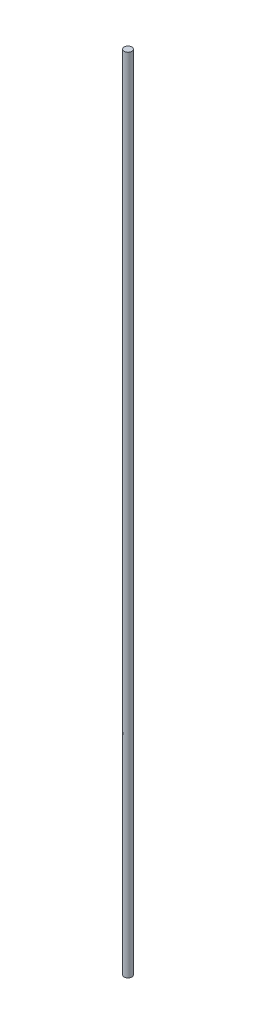
ISO-10303-21;
HEADER;
FILE_DESCRIPTION(('STEP AP214'),'2;1');
FILE_NAME('part.step','',(''),(''),'','','');
FILE_SCHEMA(('AUTOMOTIVE_DESIGN { 1 0 10303 214 1 1 1 1 }'));
ENDSEC;
DATA;
#1=APPLICATION_CONTEXT('core data for automotive mechanical design processes');
#2=APPLICATION_PROTOCOL_DEFINITION('international standard','automotive_design',2000,#1);
#3=PRODUCT_CONTEXT('',#1,'mechanical');
#4=PRODUCT('Part','Part','',(#3));
#5=PRODUCT_RELATED_PRODUCT_CATEGORY('part','',(#4));
#6=PRODUCT_DEFINITION_FORMATION('','',#4);
#7=PRODUCT_DEFINITION_CONTEXT('part definition',#1,'design');
#8=PRODUCT_DEFINITION('design','',#6,#7);
#9=PRODUCT_DEFINITION_SHAPE('','',#8);
#10=(LENGTH_UNIT() NAMED_UNIT(*) SI_UNIT(.MILLI.,.METRE.));
#11=(NAMED_UNIT(*) PLANE_ANGLE_UNIT() SI_UNIT($,.RADIAN.));
#12=(NAMED_UNIT(*) SI_UNIT($,.STERADIAN.) SOLID_ANGLE_UNIT());
#13=UNCERTAINTY_MEASURE_WITH_UNIT(LENGTH_MEASURE(1.E-05),#10,'distance_accuracy_value','');
#14=(GEOMETRIC_REPRESENTATION_CONTEXT(3) GLOBAL_UNCERTAINTY_ASSIGNED_CONTEXT((#13)) GLOBAL_UNIT_ASSIGNED_CONTEXT((#10,
#11,#12)) REPRESENTATION_CONTEXT('',''));
#15=CARTESIAN_POINT('',(0.,0.,0.));
#16=DIRECTION('',(0.,0.,1.));
#17=DIRECTION('',(1.,0.,0.));
#18=AXIS2_PLACEMENT_3D('',#15,#16,#17);
#19=CARTESIAN_POINT('',(0.,344.,0.));
#20=DIRECTION('',(0.,-1.,0.));
#21=DIRECTION('',(0.,0.,-1.));
#22=AXIS2_PLACEMENT_3D('',#19,#20,#21);
#23=CYLINDRICAL_SURFACE('',#22,1.65);
#24=CARTESIAN_POINT('',(0.,344.,0.));
#25=DIRECTION('',(0.,1.,0.));
#26=DIRECTION('',(0.,0.,1.));
#27=AXIS2_PLACEMENT_3D('',#24,#25,#26);
#28=CIRCLE('',#27,1.65);
#29=CARTESIAN_POINT('',(0.,344.,1.65));
#30=VERTEX_POINT('',#29);
#31=EDGE_CURVE('E10',#30,#30,#28,.T.);
#32=ORIENTED_EDGE('',*,*,#31,.F.);
#33=EDGE_LOOP('',(#32));
#34=FACE_BOUND('',#33,.T.);
#35=CARTESIAN_POINT('',(0.,0.,0.));
#36=DIRECTION('',(0.,1.,0.));
#37=DIRECTION('',(0.,0.,1.));
#38=AXIS2_PLACEMENT_3D('',#35,#36,#37);
#39=CIRCLE('',#38,1.65);
#40=CARTESIAN_POINT('',(0.,0.,1.65));
#41=VERTEX_POINT('',#40);
#42=EDGE_CURVE('E46',#41,#41,#39,.T.);
#43=ORIENTED_EDGE('',*,*,#42,.T.);
#44=EDGE_LOOP('',(#43));
#45=FACE_BOUND('',#44,.T.);
#46=ADVANCED_FACE('F43',(#34,#45),#23,.T.);
#47=CARTESIAN_POINT('',(0.,344.,0.));
#48=DIRECTION('',(0.,1.,0.));
#49=DIRECTION('',(0.,0.,1.));
#50=AXIS2_PLACEMENT_3D('',#47,#48,#49);
#51=PLANE('',#50);
#52=ORIENTED_EDGE('',*,*,#31,.T.);
#53=EDGE_LOOP('',(#52));
#54=FACE_BOUND('',#53,.T.);
#55=ADVANCED_FACE('F58',(#54),#51,.T.);
#56=CARTESIAN_POINT('',(0.,0.,0.));
#57=DIRECTION('',(0.,1.,0.));
#58=DIRECTION('',(0.,0.,1.));
#59=AXIS2_PLACEMENT_3D('',#56,#57,#58);
#60=PLANE('',#59);
#61=ORIENTED_EDGE('',*,*,#42,.F.);
#62=EDGE_LOOP('',(#61));
#63=FACE_BOUND('',#62,.T.);
#64=ADVANCED_FACE('F56',(#63),#60,.F.);
#65=CLOSED_SHELL('',(#46,#55,#64));
#66=MANIFOLD_SOLID_BREP('B2',#65);
#67=ADVANCED_BREP_SHAPE_REPRESENTATION('',(#18,#66),#14);
#68=SHAPE_DEFINITION_REPRESENTATION(#9,#67);
ENDSEC;
END-ISO-10303-21;
